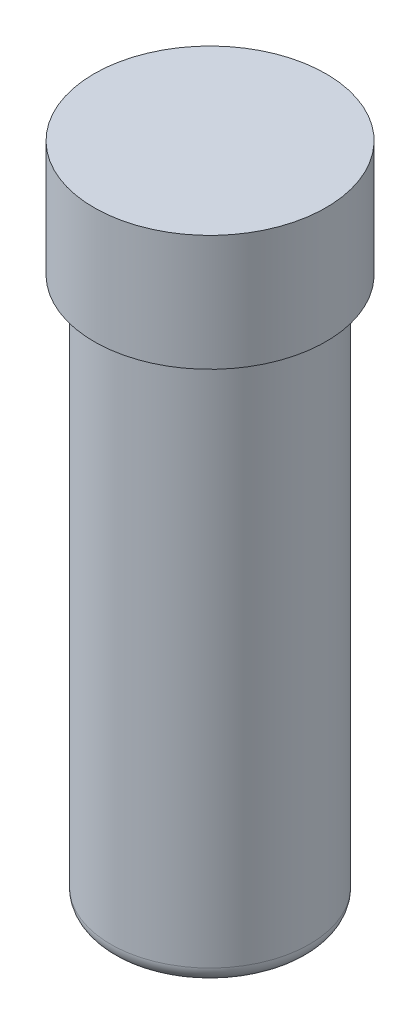
ISO-10303-21;
HEADER;
FILE_DESCRIPTION(('STEP AP214'),'2;1');
FILE_NAME('part.step','',(''),(''),'','','');
FILE_SCHEMA(('AUTOMOTIVE_DESIGN { 1 0 10303 214 1 1 1 1 }'));
ENDSEC;
DATA;
#1=APPLICATION_CONTEXT('core data for automotive mechanical design processes');
#2=APPLICATION_PROTOCOL_DEFINITION('international standard','automotive_design',2000,#1);
#3=PRODUCT_CONTEXT('',#1,'mechanical');
#4=PRODUCT('Part','Part','',(#3));
#5=PRODUCT_RELATED_PRODUCT_CATEGORY('part','',(#4));
#6=PRODUCT_DEFINITION_FORMATION('','',#4);
#7=PRODUCT_DEFINITION_CONTEXT('part definition',#1,'design');
#8=PRODUCT_DEFINITION('design','',#6,#7);
#9=PRODUCT_DEFINITION_SHAPE('','',#8);
#10=(LENGTH_UNIT() NAMED_UNIT(*) SI_UNIT(.MILLI.,.METRE.));
#11=(NAMED_UNIT(*) PLANE_ANGLE_UNIT() SI_UNIT($,.RADIAN.));
#12=(NAMED_UNIT(*) SI_UNIT($,.STERADIAN.) SOLID_ANGLE_UNIT());
#13=UNCERTAINTY_MEASURE_WITH_UNIT(LENGTH_MEASURE(1.E-05),#10,'distance_accuracy_value','');
#14=(GEOMETRIC_REPRESENTATION_CONTEXT(3) GLOBAL_UNCERTAINTY_ASSIGNED_CONTEXT((#13)) GLOBAL_UNIT_ASSIGNED_CONTEXT((#10,
#11,#12)) REPRESENTATION_CONTEXT('',''));
#15=CARTESIAN_POINT('',(0.,0.,0.));
#16=DIRECTION('',(0.,0.,1.));
#17=DIRECTION('',(1.,0.,0.));
#18=AXIS2_PLACEMENT_3D('',#15,#16,#17);
#19=CARTESIAN_POINT('',(0.,0.,0.));
#20=DIRECTION('',(0.,1.,0.));
#21=DIRECTION('',(-1.,0.,0.));
#22=AXIS2_PLACEMENT_3D('',#19,#20,#21);
#23=PLANE('',#22);
#24=CARTESIAN_POINT('',(0.,0.,0.));
#25=DIRECTION('',(0.,1.,0.));
#26=DIRECTION('',(-1.,0.,0.));
#27=AXIS2_PLACEMENT_3D('',#24,#25,#26);
#28=CIRCLE('',#27,5.);
#29=CARTESIAN_POINT('',(-5.,0.,0.));
#30=VERTEX_POINT('',#29);
#31=EDGE_CURVE('E10',#30,#30,#28,.F.);
#32=ORIENTED_EDGE('',*,*,#31,.T.);
#33=EDGE_LOOP('',(#32));
#34=FACE_BOUND('',#33,.T.);
#35=ADVANCED_FACE('F40',(#34),#23,.F.);
#36=CARTESIAN_POINT('',(0.,40.,0.));
#37=DIRECTION('',(0.,1.,0.));
#38=DIRECTION('',(-1.,0.,0.));
#39=AXIS2_PLACEMENT_3D('',#36,#37,#38);
#40=CYLINDRICAL_SURFACE('',#39,6.);
#41=CARTESIAN_POINT('',(0.,1.,0.));
#42=DIRECTION('',(0.,1.,0.));
#43=DIRECTION('',(-1.,0.,0.));
#44=AXIS2_PLACEMENT_3D('',#41,#42,#43);
#45=CIRCLE('',#44,6.);
#46=CARTESIAN_POINT('',(-6.,1.,0.));
#47=VERTEX_POINT('',#46);
#48=EDGE_CURVE('E42',#47,#47,#45,.T.);
#49=ORIENTED_EDGE('',*,*,#48,.T.);
#50=EDGE_LOOP('',(#49));
#51=FACE_BOUND('',#50,.T.);
#52=CARTESIAN_POINT('',(0.,33.,0.));
#53=DIRECTION('',(0.,1.,0.));
#54=DIRECTION('',(-1.,0.,0.));
#55=AXIS2_PLACEMENT_3D('',#52,#53,#54);
#56=CIRCLE('',#55,6.);
#57=CARTESIAN_POINT('',(-6.,33.,0.));
#58=VERTEX_POINT('',#57);
#59=EDGE_CURVE('E48',#58,#58,#56,.T.);
#60=ORIENTED_EDGE('',*,*,#59,.F.);
#61=EDGE_LOOP('',(#60));
#62=FACE_BOUND('',#61,.T.);
#63=ADVANCED_FACE('F75',(#51,#62),#40,.T.);
#64=CARTESIAN_POINT('',(6.,33.,0.));
#65=DIRECTION('',(0.,1.,0.));
#66=DIRECTION('',(-1.,0.,0.));
#67=AXIS2_PLACEMENT_3D('',#64,#65,#66);
#68=PLANE('',#67);
#69=CARTESIAN_POINT('',(0.,33.,0.));
#70=DIRECTION('',(0.,1.,0.));
#71=DIRECTION('',(-1.,0.,0.));
#72=AXIS2_PLACEMENT_3D('',#69,#70,#71);
#73=CIRCLE('',#72,7.);
#74=CARTESIAN_POINT('',(-7.,33.,0.));
#75=VERTEX_POINT('',#74);
#76=EDGE_CURVE('E55',#75,#75,#73,.T.);
#77=ORIENTED_EDGE('',*,*,#76,.F.);
#78=EDGE_LOOP('',(#77));
#79=FACE_BOUND('',#78,.T.);
#80=ORIENTED_EDGE('',*,*,#59,.T.);
#81=EDGE_LOOP('',(#80));
#82=FACE_BOUND('',#81,.T.);
#83=ADVANCED_FACE('F67',(#79,#82),#68,.F.);
#84=CARTESIAN_POINT('',(0.,40.,0.));
#85=DIRECTION('',(0.,1.,0.));
#86=DIRECTION('',(-1.,0.,0.));
#87=AXIS2_PLACEMENT_3D('',#84,#85,#86);
#88=CYLINDRICAL_SURFACE('',#87,7.);
#89=CARTESIAN_POINT('',(0.,40.,0.));
#90=DIRECTION('',(0.,1.,0.));
#91=DIRECTION('',(-1.,0.,0.));
#92=AXIS2_PLACEMENT_3D('',#89,#90,#91);
#93=CIRCLE('',#92,7.);
#94=CARTESIAN_POINT('',(-7.,40.,0.));
#95=VERTEX_POINT('',#94);
#96=EDGE_CURVE('E60',#95,#95,#93,.T.);
#97=ORIENTED_EDGE('',*,*,#96,.F.);
#98=EDGE_LOOP('',(#97));
#99=FACE_BOUND('',#98,.T.);
#100=ORIENTED_EDGE('',*,*,#76,.T.);
#101=EDGE_LOOP('',(#100));
#102=FACE_BOUND('',#101,.T.);
#103=ADVANCED_FACE('F63',(#99,#102),#88,.T.);
#104=CARTESIAN_POINT('',(7.,40.,0.));
#105=DIRECTION('',(0.,-1.,0.));
#106=DIRECTION('',(1.,0.,0.));
#107=AXIS2_PLACEMENT_3D('',#104,#105,#106);
#108=PLANE('',#107);
#109=ORIENTED_EDGE('',*,*,#96,.T.);
#110=EDGE_LOOP('',(#109));
#111=FACE_BOUND('',#110,.T.);
#112=ADVANCED_FACE('F62',(#111),#108,.F.);
#113=CARTESIAN_POINT('',(0.,1.,0.));
#114=DIRECTION('',(0.,1.,0.));
#115=DIRECTION('',(-1.,0.,0.));
#116=AXIS2_PLACEMENT_3D('',#113,#114,#115);
#117=TOROIDAL_SURFACE('',#116,5.,1.);
#118=ORIENTED_EDGE('',*,*,#31,.F.);
#119=EDGE_LOOP('',(#118));
#120=FACE_BOUND('',#119,.T.);
#121=ORIENTED_EDGE('',*,*,#48,.F.);
#122=EDGE_LOOP('',(#121));
#123=FACE_BOUND('',#122,.T.);
#124=ADVANCED_FACE('F39',(#120,#123),#117,.T.);
#125=CLOSED_SHELL('',(#35,#63,#83,#103,#112,#124));
#126=MANIFOLD_SOLID_BREP('B2',#125);
#127=ADVANCED_BREP_SHAPE_REPRESENTATION('',(#18,#126),#14);
#128=SHAPE_DEFINITION_REPRESENTATION(#9,#127);
ENDSEC;
END-ISO-10303-21;
